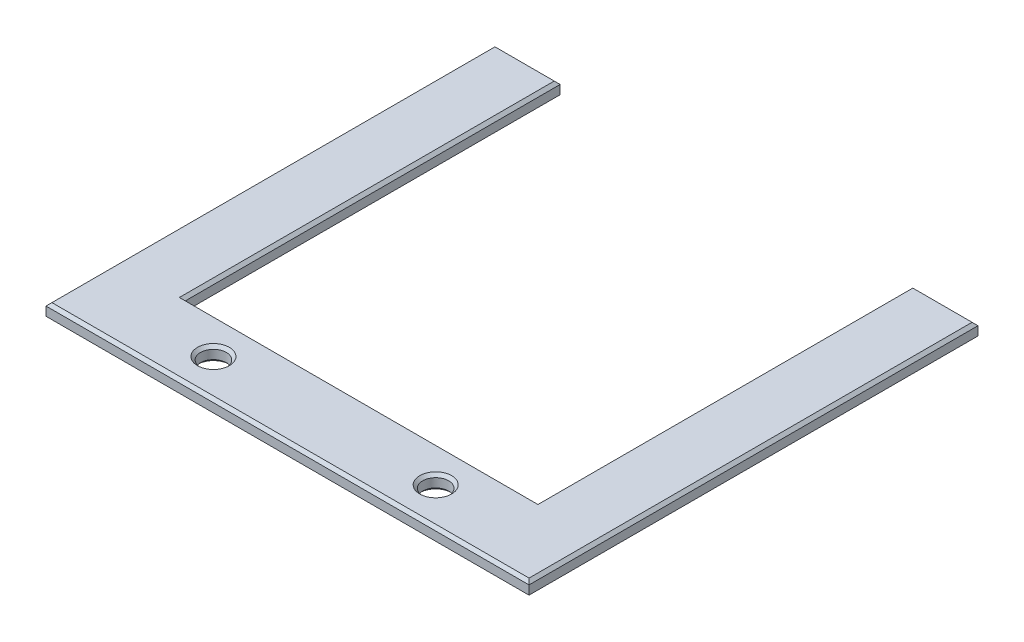
ISO-10303-21;
HEADER;
FILE_DESCRIPTION(('STEP AP214'),'2;1');
FILE_NAME('part.step','',(''),(''),'','','');
FILE_SCHEMA(('AUTOMOTIVE_DESIGN { 1 0 10303 214 1 1 1 1 }'));
ENDSEC;
DATA;
#1=APPLICATION_CONTEXT('core data for automotive mechanical design processes');
#2=APPLICATION_PROTOCOL_DEFINITION('international standard','automotive_design',2000,#1);
#3=PRODUCT_CONTEXT('',#1,'mechanical');
#4=PRODUCT('Part','Part','',(#3));
#5=PRODUCT_RELATED_PRODUCT_CATEGORY('part','',(#4));
#6=PRODUCT_DEFINITION_FORMATION('','',#4);
#7=PRODUCT_DEFINITION_CONTEXT('part definition',#1,'design');
#8=PRODUCT_DEFINITION('design','',#6,#7);
#9=PRODUCT_DEFINITION_SHAPE('','',#8);
#10=(LENGTH_UNIT() NAMED_UNIT(*) SI_UNIT(.MILLI.,.METRE.));
#11=(NAMED_UNIT(*) PLANE_ANGLE_UNIT() SI_UNIT($,.RADIAN.));
#12=(NAMED_UNIT(*) SI_UNIT($,.STERADIAN.) SOLID_ANGLE_UNIT());
#13=UNCERTAINTY_MEASURE_WITH_UNIT(LENGTH_MEASURE(1.E-05),#10,'distance_accuracy_value','');
#14=(GEOMETRIC_REPRESENTATION_CONTEXT(3) GLOBAL_UNCERTAINTY_ASSIGNED_CONTEXT((#13)) GLOBAL_UNIT_ASSIGNED_CONTEXT((#10,
#11,#12)) REPRESENTATION_CONTEXT('',''));
#15=CARTESIAN_POINT('',(0.,0.,0.));
#16=DIRECTION('',(0.,0.,1.));
#17=DIRECTION('',(1.,0.,0.));
#18=AXIS2_PLACEMENT_3D('',#15,#16,#17);
#19=CARTESIAN_POINT('',(0.,2.,0.));
#20=DIRECTION('',(0.,1.,0.));
#21=DIRECTION('',(0.,0.,1.));
#22=AXIS2_PLACEMENT_3D('',#19,#20,#21);
#23=PLANE('',#22);
#24=CARTESIAN_POINT('',(15.,2.,-5.));
#25=DIRECTION('',(0.,1.,0.));
#26=DIRECTION('',(0.,0.,1.));
#27=AXIS2_PLACEMENT_3D('',#24,#25,#26);
#28=CIRCLE('',#27,2.15000000000001);
#29=CARTESIAN_POINT('',(15.,2.,-2.84999999999999));
#30=VERTEX_POINT('',#29);
#31=EDGE_CURVE('E11',#30,#30,#28,.F.);
#32=ORIENTED_EDGE('',*,*,#31,.T.);
#33=EDGE_LOOP('',(#32));
#34=FACE_BOUND('',#33,.T.);
#35=DIRECTION('',(0.,0.,-1.));
#36=VECTOR('',#35,1.);
#37=CARTESIAN_POINT('',(-24.2,2.,-60.6));
#38=LINE('',#37,#36);
#39=CARTESIAN_POINT('',(-24.2,2.,-9.59999999999998));
#40=VERTEX_POINT('',#39);
#41=CARTESIAN_POINT('',(-24.2,2.,-60.2));
#42=VERTEX_POINT('',#41);
#43=EDGE_CURVE('E53',#40,#42,#38,.T.);
#44=ORIENTED_EDGE('',*,*,#43,.T.);
#45=DIRECTION('',(-1.,0.,0.));
#46=VECTOR('',#45,1.);
#47=CARTESIAN_POINT('',(-32.6,2.,-60.2));
#48=LINE('',#47,#46);
#49=CARTESIAN_POINT('',(-32.2,2.,-60.2));
#50=VERTEX_POINT('',#49);
#51=EDGE_CURVE('E45',#42,#50,#48,.T.);
#52=ORIENTED_EDGE('',*,*,#51,.T.);
#53=DIRECTION('',(0.,0.,1.));
#54=VECTOR('',#53,1.);
#55=CARTESIAN_POINT('',(-32.2,2.,0.));
#56=LINE('',#55,#54);
#57=CARTESIAN_POINT('',(-32.2,2.,-0.400000000000011));
#58=VERTEX_POINT('',#57);
#59=EDGE_CURVE('E236',#50,#58,#56,.T.);
#60=ORIENTED_EDGE('',*,*,#59,.T.);
#61=DIRECTION('',(1.,0.,0.));
#62=VECTOR('',#61,1.);
#63=CARTESIAN_POINT('',(32.6,2.,-0.400000000000011));
#64=LINE('',#63,#62);
#65=CARTESIAN_POINT('',(32.2,2.,-0.400000000000011));
#66=VERTEX_POINT('',#65);
#67=EDGE_CURVE('E238',#58,#66,#64,.T.);
#68=ORIENTED_EDGE('',*,*,#67,.T.);
#69=DIRECTION('',(0.,0.,-1.));
#70=VECTOR('',#69,1.);
#71=CARTESIAN_POINT('',(32.2,2.,-60.6));
#72=LINE('',#71,#70);
#73=CARTESIAN_POINT('',(32.2,2.,-60.2));
#74=VERTEX_POINT('',#73);
#75=EDGE_CURVE('E240',#66,#74,#72,.T.);
#76=ORIENTED_EDGE('',*,*,#75,.T.);
#77=DIRECTION('',(-1.,0.,0.));
#78=VECTOR('',#77,1.);
#79=CARTESIAN_POINT('',(23.8,2.,-60.2));
#80=LINE('',#79,#78);
#81=CARTESIAN_POINT('',(24.2,2.,-60.2));
#82=VERTEX_POINT('',#81);
#83=EDGE_CURVE('E242',#74,#82,#80,.T.);
#84=ORIENTED_EDGE('',*,*,#83,.T.);
#85=DIRECTION('',(0.,0.,1.));
#86=VECTOR('',#85,1.);
#87=CARTESIAN_POINT('',(24.2,2.,-9.99999999999999));
#88=LINE('',#87,#86);
#89=CARTESIAN_POINT('',(24.2,2.,-9.59999999999998));
#90=VERTEX_POINT('',#89);
#91=EDGE_CURVE('E244',#82,#90,#88,.T.);
#92=ORIENTED_EDGE('',*,*,#91,.T.);
#93=DIRECTION('',(-1.,0.,0.));
#94=VECTOR('',#93,1.);
#95=CARTESIAN_POINT('',(-23.8,2.,-9.59999999999998));
#96=LINE('',#95,#94);
#97=EDGE_CURVE('E58',#90,#40,#96,.T.);
#98=ORIENTED_EDGE('',*,*,#97,.T.);
#99=EDGE_LOOP('',(#44,#52,#60,#68,#76,#84,#92,#98));
#100=FACE_BOUND('',#99,.T.);
#101=CARTESIAN_POINT('',(-15.,2.,-5.));
#102=DIRECTION('',(0.,1.,0.));
#103=DIRECTION('',(0.,0.,1.));
#104=AXIS2_PLACEMENT_3D('',#101,#102,#103);
#105=CIRCLE('',#104,2.15);
#106=CARTESIAN_POINT('',(-15.,2.,-2.85));
#107=VERTEX_POINT('',#106);
#108=EDGE_CURVE('E233',#107,#107,#105,.F.);
#109=ORIENTED_EDGE('',*,*,#108,.T.);
#110=EDGE_LOOP('',(#109));
#111=FACE_BOUND('',#110,.T.);
#112=ADVANCED_FACE('F35',(#34,#100,#111),#23,.T.);
#113=CARTESIAN_POINT('',(0.,0.,0.));
#114=DIRECTION('',(0.,1.,0.));
#115=DIRECTION('',(0.,0.,1.));
#116=AXIS2_PLACEMENT_3D('',#113,#114,#115);
#117=PLANE('',#116);
#118=CARTESIAN_POINT('',(15.,0.,-5.));
#119=DIRECTION('',(0.,1.,0.));
#120=DIRECTION('',(0.,0.,1.));
#121=AXIS2_PLACEMENT_3D('',#118,#119,#120);
#122=CIRCLE('',#121,2.15000000000001);
#123=CARTESIAN_POINT('',(15.,0.,-2.84999999999999));
#124=VERTEX_POINT('',#123);
#125=EDGE_CURVE('E181',#124,#124,#122,.T.);
#126=ORIENTED_EDGE('',*,*,#125,.T.);
#127=EDGE_LOOP('',(#126));
#128=FACE_BOUND('',#127,.T.);
#129=CARTESIAN_POINT('',(-15.,0.,-5.));
#130=DIRECTION('',(0.,1.,0.));
#131=DIRECTION('',(0.,0.,1.));
#132=AXIS2_PLACEMENT_3D('',#129,#130,#131);
#133=CIRCLE('',#132,2.14999999999998);
#134=CARTESIAN_POINT('',(-15.,0.,-2.85000000000002));
#135=VERTEX_POINT('',#134);
#136=EDGE_CURVE('E178',#135,#135,#133,.T.);
#137=ORIENTED_EDGE('',*,*,#136,.T.);
#138=EDGE_LOOP('',(#137));
#139=FACE_BOUND('',#138,.T.);
#140=DIRECTION('',(0.,0.,1.));
#141=VECTOR('',#140,1.);
#142=CARTESIAN_POINT('',(32.2,0.,0.));
#143=LINE('',#142,#141);
#144=CARTESIAN_POINT('',(32.2,0.,-60.2));
#145=VERTEX_POINT('',#144);
#146=CARTESIAN_POINT('',(32.2,0.,-0.399999999999998));
#147=VERTEX_POINT('',#146);
#148=EDGE_CURVE('E177',#145,#147,#143,.T.);
#149=ORIENTED_EDGE('',*,*,#148,.T.);
#150=DIRECTION('',(-1.,0.,0.));
#151=VECTOR('',#150,1.);
#152=CARTESIAN_POINT('',(0.,0.,-0.399999999999998));
#153=LINE('',#152,#151);
#154=CARTESIAN_POINT('',(-32.2,0.,-0.399999999999998));
#155=VERTEX_POINT('',#154);
#156=EDGE_CURVE('E156',#147,#155,#153,.T.);
#157=ORIENTED_EDGE('',*,*,#156,.T.);
#158=DIRECTION('',(0.,0.,-1.));
#159=VECTOR('',#158,1.);
#160=CARTESIAN_POINT('',(-32.2,0.,0.));
#161=LINE('',#160,#159);
#162=CARTESIAN_POINT('',(-32.2,0.,-60.2));
#163=VERTEX_POINT('',#162);
#164=EDGE_CURVE('E166',#155,#163,#161,.T.);
#165=ORIENTED_EDGE('',*,*,#164,.T.);
#166=DIRECTION('',(1.,0.,0.));
#167=VECTOR('',#166,1.);
#168=CARTESIAN_POINT('',(0.,0.,-60.2));
#169=LINE('',#168,#167);
#170=CARTESIAN_POINT('',(-24.2,0.,-60.2));
#171=VERTEX_POINT('',#170);
#172=EDGE_CURVE('E172',#163,#171,#169,.T.);
#173=ORIENTED_EDGE('',*,*,#172,.T.);
#174=DIRECTION('',(0.,0.,1.));
#175=VECTOR('',#174,1.);
#176=CARTESIAN_POINT('',(-24.2,0.,0.));
#177=LINE('',#176,#175);
#178=CARTESIAN_POINT('',(-24.2,0.,-9.6));
#179=VERTEX_POINT('',#178);
#180=EDGE_CURVE('E322',#171,#179,#177,.T.);
#181=ORIENTED_EDGE('',*,*,#180,.T.);
#182=DIRECTION('',(1.,0.,0.));
#183=VECTOR('',#182,1.);
#184=CARTESIAN_POINT('',(0.,0.,-9.6));
#185=LINE('',#184,#183);
#186=CARTESIAN_POINT('',(24.2,0.,-9.6));
#187=VERTEX_POINT('',#186);
#188=EDGE_CURVE('E324',#179,#187,#185,.T.);
#189=ORIENTED_EDGE('',*,*,#188,.T.);
#190=DIRECTION('',(0.,0.,-1.));
#191=VECTOR('',#190,1.);
#192=CARTESIAN_POINT('',(24.2,0.,0.));
#193=LINE('',#192,#191);
#194=CARTESIAN_POINT('',(24.2,0.,-60.2));
#195=VERTEX_POINT('',#194);
#196=EDGE_CURVE('E326',#187,#195,#193,.T.);
#197=ORIENTED_EDGE('',*,*,#196,.T.);
#198=DIRECTION('',(1.,0.,0.));
#199=VECTOR('',#198,1.);
#200=CARTESIAN_POINT('',(0.,0.,-60.2));
#201=LINE('',#200,#199);
#202=EDGE_CURVE('E183',#195,#145,#201,.T.);
#203=ORIENTED_EDGE('',*,*,#202,.T.);
#204=EDGE_LOOP('',(#149,#157,#165,#173,#181,#189,#197,#203));
#205=FACE_BOUND('',#204,.T.);
#206=ADVANCED_FACE('F175',(#128,#139,#205),#117,.F.);
#207=CARTESIAN_POINT('',(-32.6,2.,-60.6));
#208=DIRECTION('',(1.,0.,0.));
#209=DIRECTION('',(0.,0.,-1.));
#210=AXIS2_PLACEMENT_3D('',#207,#208,#209);
#211=PLANE('',#210);
#212=DIRECTION('',(0.,-1.,0.));
#213=VECTOR('',#212,1.);
#214=CARTESIAN_POINT('',(-32.6,2.,-60.6));
#215=LINE('',#214,#213);
#216=CARTESIAN_POINT('',(-32.6,1.59999999999999,-60.6));
#217=VERTEX_POINT('',#216);
#218=CARTESIAN_POINT('',(-32.6,0.399999999999984,-60.6));
#219=VERTEX_POINT('',#218);
#220=EDGE_CURVE('E265',#217,#219,#215,.T.);
#221=ORIENTED_EDGE('',*,*,#220,.T.);
#222=DIRECTION('',(0.,0.,1.));
#223=VECTOR('',#222,1.);
#224=CARTESIAN_POINT('',(-32.6,0.399999999999984,-60.6));
#225=LINE('',#224,#223);
#226=CARTESIAN_POINT('',(-32.6,0.399999999999984,0.));
#227=VERTEX_POINT('',#226);
#228=EDGE_CURVE('E231',#219,#227,#225,.T.);
#229=ORIENTED_EDGE('',*,*,#228,.T.);
#230=DIRECTION('',(0.,-1.,0.));
#231=VECTOR('',#230,1.);
#232=CARTESIAN_POINT('',(-32.6,2.,0.));
#233=LINE('',#232,#231);
#234=CARTESIAN_POINT('',(-32.6,1.59999999999999,0.));
#235=VERTEX_POINT('',#234);
#236=EDGE_CURVE('E173',#235,#227,#233,.T.);
#237=ORIENTED_EDGE('',*,*,#236,.F.);
#238=DIRECTION('',(0.,0.,-1.));
#239=VECTOR('',#238,1.);
#240=CARTESIAN_POINT('',(-32.6,1.59999999999999,-60.6));
#241=LINE('',#240,#239);
#242=EDGE_CURVE('E229',#235,#217,#241,.T.);
#243=ORIENTED_EDGE('',*,*,#242,.T.);
#244=EDGE_LOOP('',(#221,#229,#237,#243));
#245=FACE_BOUND('',#244,.T.);
#246=ADVANCED_FACE('F343',(#245),#211,.F.);
#247=CARTESIAN_POINT('',(-32.6,2.,0.));
#248=DIRECTION('',(0.,0.,-1.));
#249=DIRECTION('',(-1.,0.,0.));
#250=AXIS2_PLACEMENT_3D('',#247,#248,#249);
#251=PLANE('',#250);
#252=ORIENTED_EDGE('',*,*,#236,.T.);
#253=DIRECTION('',(1.,0.,0.));
#254=VECTOR('',#253,1.);
#255=CARTESIAN_POINT('',(-32.6,0.399999999999984,0.));
#256=LINE('',#255,#254);
#257=CARTESIAN_POINT('',(32.6,0.399999999999984,0.));
#258=VERTEX_POINT('',#257);
#259=EDGE_CURVE('E159',#227,#258,#256,.T.);
#260=ORIENTED_EDGE('',*,*,#259,.T.);
#261=DIRECTION('',(0.,-1.,0.));
#262=VECTOR('',#261,1.);
#263=CARTESIAN_POINT('',(32.6,2.,0.));
#264=LINE('',#263,#262);
#265=CARTESIAN_POINT('',(32.6,1.59999999999999,0.));
#266=VERTEX_POINT('',#265);
#267=EDGE_CURVE('E312',#266,#258,#264,.T.);
#268=ORIENTED_EDGE('',*,*,#267,.F.);
#269=DIRECTION('',(-1.,0.,0.));
#270=VECTOR('',#269,1.);
#271=CARTESIAN_POINT('',(-32.6,1.59999999999999,0.));
#272=LINE('',#271,#270);
#273=EDGE_CURVE('E201',#266,#235,#272,.T.);
#274=ORIENTED_EDGE('',*,*,#273,.T.);
#275=EDGE_LOOP('',(#252,#260,#268,#274));
#276=FACE_BOUND('',#275,.T.);
#277=ADVANCED_FACE('F336',(#276),#251,.F.);
#278=CARTESIAN_POINT('',(32.6,2.,0.));
#279=DIRECTION('',(-1.,0.,0.));
#280=DIRECTION('',(0.,0.,1.));
#281=AXIS2_PLACEMENT_3D('',#278,#279,#280);
#282=PLANE('',#281);
#283=ORIENTED_EDGE('',*,*,#267,.T.);
#284=DIRECTION('',(0.,0.,-1.));
#285=VECTOR('',#284,1.);
#286=CARTESIAN_POINT('',(32.6,0.399999999999984,0.));
#287=LINE('',#286,#285);
#288=CARTESIAN_POINT('',(32.6,0.399999999999984,-60.6));
#289=VERTEX_POINT('',#288);
#290=EDGE_CURVE('E206',#258,#289,#287,.T.);
#291=ORIENTED_EDGE('',*,*,#290,.T.);
#292=DIRECTION('',(0.,-1.,0.));
#293=VECTOR('',#292,1.);
#294=CARTESIAN_POINT('',(32.6,2.,-60.6));
#295=LINE('',#294,#293);
#296=CARTESIAN_POINT('',(32.6,1.59999999999999,-60.6));
#297=VERTEX_POINT('',#296);
#298=EDGE_CURVE('E303',#297,#289,#295,.T.);
#299=ORIENTED_EDGE('',*,*,#298,.F.);
#300=DIRECTION('',(0.,0.,1.));
#301=VECTOR('',#300,1.);
#302=CARTESIAN_POINT('',(32.6,1.59999999999999,0.));
#303=LINE('',#302,#301);
#304=EDGE_CURVE('E204',#297,#266,#303,.T.);
#305=ORIENTED_EDGE('',*,*,#304,.T.);
#306=EDGE_LOOP('',(#283,#291,#299,#305));
#307=FACE_BOUND('',#306,.T.);
#308=ADVANCED_FACE('F309',(#307),#282,.F.);
#309=CARTESIAN_POINT('',(32.6,2.,-60.6));
#310=DIRECTION('',(0.,0.,1.));
#311=DIRECTION('',(1.,0.,0.));
#312=AXIS2_PLACEMENT_3D('',#309,#310,#311);
#313=PLANE('',#312);
#314=ORIENTED_EDGE('',*,*,#298,.T.);
#315=DIRECTION('',(-1.,0.,0.));
#316=VECTOR('',#315,1.);
#317=CARTESIAN_POINT('',(32.6,0.399999999999984,-60.6));
#318=LINE('',#317,#316);
#319=CARTESIAN_POINT('',(23.8,0.399999999999984,-60.6));
#320=VERTEX_POINT('',#319);
#321=EDGE_CURVE('E210',#289,#320,#318,.T.);
#322=ORIENTED_EDGE('',*,*,#321,.T.);
#323=DIRECTION('',(0.,-1.,0.));
#324=VECTOR('',#323,1.);
#325=CARTESIAN_POINT('',(23.8,2.,-60.6));
#326=LINE('',#325,#324);
#327=CARTESIAN_POINT('',(23.8,1.59999999999999,-60.6));
#328=VERTEX_POINT('',#327);
#329=EDGE_CURVE('E306',#328,#320,#326,.T.);
#330=ORIENTED_EDGE('',*,*,#329,.F.);
#331=DIRECTION('',(1.,0.,0.));
#332=VECTOR('',#331,1.);
#333=CARTESIAN_POINT('',(32.6,1.59999999999999,-60.6));
#334=LINE('',#333,#332);
#335=EDGE_CURVE('E208',#328,#297,#334,.T.);
#336=ORIENTED_EDGE('',*,*,#335,.T.);
#337=EDGE_LOOP('',(#314,#322,#330,#336));
#338=FACE_BOUND('',#337,.T.);
#339=ADVANCED_FACE('F302',(#338),#313,.F.);
#340=CARTESIAN_POINT('',(23.8,2.,-60.6));
#341=DIRECTION('',(1.,0.,0.));
#342=DIRECTION('',(0.,0.,-1.));
#343=AXIS2_PLACEMENT_3D('',#340,#341,#342);
#344=PLANE('',#343);
#345=ORIENTED_EDGE('',*,*,#329,.T.);
#346=DIRECTION('',(0.,0.,1.));
#347=VECTOR('',#346,1.);
#348=CARTESIAN_POINT('',(23.8,0.399999999999984,-60.6));
#349=LINE('',#348,#347);
#350=CARTESIAN_POINT('',(23.8,0.399999999999984,-9.99999999999999));
#351=VERTEX_POINT('',#350);
#352=EDGE_CURVE('E214',#320,#351,#349,.T.);
#353=ORIENTED_EDGE('',*,*,#352,.T.);
#354=DIRECTION('',(0.,-1.,0.));
#355=VECTOR('',#354,1.);
#356=CARTESIAN_POINT('',(23.8,2.,-9.99999999999999));
#357=LINE('',#356,#355);
#358=CARTESIAN_POINT('',(23.8,1.59999999999999,-9.99999999999999));
#359=VERTEX_POINT('',#358);
#360=EDGE_CURVE('E315',#359,#351,#357,.T.);
#361=ORIENTED_EDGE('',*,*,#360,.F.);
#362=DIRECTION('',(0.,0.,-1.));
#363=VECTOR('',#362,1.);
#364=CARTESIAN_POINT('',(23.8,1.59999999999999,-60.6));
#365=LINE('',#364,#363);
#366=EDGE_CURVE('E212',#359,#328,#365,.T.);
#367=ORIENTED_EDGE('',*,*,#366,.T.);
#368=EDGE_LOOP('',(#345,#353,#361,#367));
#369=FACE_BOUND('',#368,.T.);
#370=ADVANCED_FACE('F388',(#369),#344,.F.);
#371=CARTESIAN_POINT('',(23.8,2.,-9.99999999999999));
#372=DIRECTION('',(0.,0.,1.));
#373=DIRECTION('',(1.,0.,0.));
#374=AXIS2_PLACEMENT_3D('',#371,#372,#373);
#375=PLANE('',#374);
#376=ORIENTED_EDGE('',*,*,#360,.T.);
#377=DIRECTION('',(-1.,0.,0.));
#378=VECTOR('',#377,1.);
#379=CARTESIAN_POINT('',(23.8,0.399999999999984,-9.99999999999999));
#380=LINE('',#379,#378);
#381=CARTESIAN_POINT('',(-23.8,0.399999999999984,-9.99999999999999));
#382=VERTEX_POINT('',#381);
#383=EDGE_CURVE('E218',#351,#382,#380,.T.);
#384=ORIENTED_EDGE('',*,*,#383,.T.);
#385=DIRECTION('',(0.,-1.,0.));
#386=VECTOR('',#385,1.);
#387=CARTESIAN_POINT('',(-23.8,2.,-9.99999999999999));
#388=LINE('',#387,#386);
#389=CARTESIAN_POINT('',(-23.8,1.59999999999999,-9.99999999999999));
#390=VERTEX_POINT('',#389);
#391=EDGE_CURVE('E369',#390,#382,#388,.T.);
#392=ORIENTED_EDGE('',*,*,#391,.F.);
#393=DIRECTION('',(1.,0.,0.));
#394=VECTOR('',#393,1.);
#395=CARTESIAN_POINT('',(23.8,1.59999999999999,-9.99999999999999));
#396=LINE('',#395,#394);
#397=EDGE_CURVE('E216',#390,#359,#396,.T.);
#398=ORIENTED_EDGE('',*,*,#397,.T.);
#399=EDGE_LOOP('',(#376,#384,#392,#398));
#400=FACE_BOUND('',#399,.T.);
#401=ADVANCED_FACE('F377',(#400),#375,.F.);
#402=CARTESIAN_POINT('',(-23.8,2.,-9.99999999999999));
#403=DIRECTION('',(-1.,0.,0.));
#404=DIRECTION('',(0.,0.,1.));
#405=AXIS2_PLACEMENT_3D('',#402,#403,#404);
#406=PLANE('',#405);
#407=ORIENTED_EDGE('',*,*,#391,.T.);
#408=DIRECTION('',(0.,0.,-1.));
#409=VECTOR('',#408,1.);
#410=CARTESIAN_POINT('',(-23.8,0.399999999999984,-9.99999999999999));
#411=LINE('',#410,#409);
#412=CARTESIAN_POINT('',(-23.8,0.399999999999984,-60.6));
#413=VERTEX_POINT('',#412);
#414=EDGE_CURVE('E222',#382,#413,#411,.T.);
#415=ORIENTED_EDGE('',*,*,#414,.T.);
#416=DIRECTION('',(0.,-1.,0.));
#417=VECTOR('',#416,1.);
#418=CARTESIAN_POINT('',(-23.8,2.,-60.6));
#419=LINE('',#418,#417);
#420=CARTESIAN_POINT('',(-23.8,1.59999999999999,-60.6));
#421=VERTEX_POINT('',#420);
#422=EDGE_CURVE('E362',#421,#413,#419,.T.);
#423=ORIENTED_EDGE('',*,*,#422,.F.);
#424=DIRECTION('',(0.,0.,1.));
#425=VECTOR('',#424,1.);
#426=CARTESIAN_POINT('',(-23.8,1.59999999999999,-9.99999999999999));
#427=LINE('',#426,#425);
#428=EDGE_CURVE('E220',#421,#390,#427,.T.);
#429=ORIENTED_EDGE('',*,*,#428,.T.);
#430=EDGE_LOOP('',(#407,#415,#423,#429));
#431=FACE_BOUND('',#430,.T.);
#432=ADVANCED_FACE('F366',(#431),#406,.F.);
#433=CARTESIAN_POINT('',(-23.8,2.,-60.6));
#434=DIRECTION('',(0.,0.,1.));
#435=DIRECTION('',(1.,0.,0.));
#436=AXIS2_PLACEMENT_3D('',#433,#434,#435);
#437=PLANE('',#436);
#438=ORIENTED_EDGE('',*,*,#422,.T.);
#439=DIRECTION('',(-1.,0.,0.));
#440=VECTOR('',#439,1.);
#441=CARTESIAN_POINT('',(-23.8,0.399999999999984,-60.6));
#442=LINE('',#441,#440);
#443=EDGE_CURVE('E227',#413,#219,#442,.T.);
#444=ORIENTED_EDGE('',*,*,#443,.T.);
#445=ORIENTED_EDGE('',*,*,#220,.F.);
#446=DIRECTION('',(1.,0.,0.));
#447=VECTOR('',#446,1.);
#448=CARTESIAN_POINT('',(-23.8,1.59999999999999,-60.6));
#449=LINE('',#448,#447);
#450=EDGE_CURVE('E224',#217,#421,#449,.T.);
#451=ORIENTED_EDGE('',*,*,#450,.T.);
#452=EDGE_LOOP('',(#438,#444,#445,#451));
#453=FACE_BOUND('',#452,.T.);
#454=ADVANCED_FACE('F361',(#453),#437,.F.);
#455=CARTESIAN_POINT('',(-15.,2.,-5.));
#456=DIRECTION('',(0.,-1.,0.));
#457=DIRECTION('',(0.,0.,-1.));
#458=AXIS2_PLACEMENT_3D('',#455,#456,#457);
#459=CYLINDRICAL_SURFACE('',#458,1.75);
#460=CARTESIAN_POINT('',(-15.,0.399999999999983,-5.));
#461=DIRECTION('',(0.,1.,0.));
#462=DIRECTION('',(0.,0.,1.));
#463=AXIS2_PLACEMENT_3D('',#460,#461,#462);
#464=CIRCLE('',#463,1.75);
#465=CARTESIAN_POINT('',(-15.,0.399999999999983,-3.25));
#466=VERTEX_POINT('',#465);
#467=EDGE_CURVE('E198',#466,#466,#464,.F.);
#468=ORIENTED_EDGE('',*,*,#467,.T.);
#469=EDGE_LOOP('',(#468));
#470=FACE_BOUND('',#469,.T.);
#471=CARTESIAN_POINT('',(-15.,1.59999999999999,-5.));
#472=DIRECTION('',(0.,1.,0.));
#473=DIRECTION('',(0.,0.,1.));
#474=AXIS2_PLACEMENT_3D('',#471,#472,#473);
#475=CIRCLE('',#474,1.75);
#476=CARTESIAN_POINT('',(-15.,1.59999999999999,-3.25));
#477=VERTEX_POINT('',#476);
#478=EDGE_CURVE('E195',#477,#477,#475,.T.);
#479=ORIENTED_EDGE('',*,*,#478,.T.);
#480=EDGE_LOOP('',(#479));
#481=FACE_BOUND('',#480,.T.);
#482=ADVANCED_FACE('F406',(#470,#481),#459,.F.);
#483=CARTESIAN_POINT('',(15.,2.,-5.));
#484=DIRECTION('',(0.,-1.,0.));
#485=DIRECTION('',(0.,0.,-1.));
#486=AXIS2_PLACEMENT_3D('',#483,#484,#485);
#487=CYLINDRICAL_SURFACE('',#486,1.75);
#488=CARTESIAN_POINT('',(15.,0.400000000000004,-5.));
#489=DIRECTION('',(0.,1.,0.));
#490=DIRECTION('',(0.,0.,1.));
#491=AXIS2_PLACEMENT_3D('',#488,#489,#490);
#492=CIRCLE('',#491,1.75);
#493=CARTESIAN_POINT('',(15.,0.400000000000004,-3.25));
#494=VERTEX_POINT('',#493);
#495=EDGE_CURVE('E192',#494,#494,#492,.F.);
#496=ORIENTED_EDGE('',*,*,#495,.T.);
#497=EDGE_LOOP('',(#496));
#498=FACE_BOUND('',#497,.T.);
#499=CARTESIAN_POINT('',(15.,1.6,-5.));
#500=DIRECTION('',(0.,1.,0.));
#501=DIRECTION('',(0.,0.,1.));
#502=AXIS2_PLACEMENT_3D('',#499,#500,#501);
#503=CIRCLE('',#502,1.75);
#504=CARTESIAN_POINT('',(15.,1.6,-3.25));
#505=VERTEX_POINT('',#504);
#506=EDGE_CURVE('E189',#505,#505,#503,.T.);
#507=ORIENTED_EDGE('',*,*,#506,.T.);
#508=EDGE_LOOP('',(#507));
#509=FACE_BOUND('',#508,.T.);
#510=ADVANCED_FACE('F426',(#498,#509),#487,.F.);
#511=CARTESIAN_POINT('',(15.,0.,-5.));
#512=DIRECTION('',(0.,-1.,0.));
#513=DIRECTION('',(0.,0.,-1.));
#514=AXIS2_PLACEMENT_3D('',#511,#512,#513);
#515=CONICAL_SURFACE('',#514,2.15000000000001,0.785398163397451);
#516=ORIENTED_EDGE('',*,*,#495,.F.);
#517=EDGE_LOOP('',(#516));
#518=FACE_BOUND('',#517,.T.);
#519=ORIENTED_EDGE('',*,*,#125,.F.);
#520=EDGE_LOOP('',(#519));
#521=FACE_BOUND('',#520,.T.);
#522=ADVANCED_FACE('F433',(#518,#521),#515,.F.);
#523=CARTESIAN_POINT('',(-15.,0.,-5.));
#524=DIRECTION('',(0.,-1.,0.));
#525=DIRECTION('',(0.,0.,-1.));
#526=AXIS2_PLACEMENT_3D('',#523,#524,#525);
#527=CONICAL_SURFACE('',#526,2.14999999999998,0.785398163397443);
#528=ORIENTED_EDGE('',*,*,#467,.F.);
#529=EDGE_LOOP('',(#528));
#530=FACE_BOUND('',#529,.T.);
#531=ORIENTED_EDGE('',*,*,#136,.F.);
#532=EDGE_LOOP('',(#531));
#533=FACE_BOUND('',#532,.T.);
#534=ADVANCED_FACE('F440',(#530,#533),#527,.F.);
#535=CARTESIAN_POINT('',(23.8,0.399999999999984,-9.99999999999999));
#536=DIRECTION('',(0.,0.70710678118656,0.707106781186535));
#537=DIRECTION('',(-1.,0.,0.));
#538=AXIS2_PLACEMENT_3D('',#535,#536,#537);
#539=PLANE('',#538);
#540=DIRECTION('',(0.577350269189633,-0.577350269189612,0.577350269189633));
#541=VECTOR('',#540,1.);
#542=CARTESIAN_POINT('',(6.93333333333294,17.2666666666665,-26.8666666666671));
#543=LINE('',#542,#541);
#544=EDGE_CURVE('E259',#187,#351,#543,.F.);
#545=ORIENTED_EDGE('',*,*,#544,.F.);
#546=ORIENTED_EDGE('',*,*,#188,.F.);
#547=DIRECTION('',(-0.577350269189633,-0.577350269189612,0.577350269189633));
#548=VECTOR('',#547,1.);
#549=CARTESIAN_POINT('',(-7.93333333333297,16.2666666666665,-25.866666666667));
#550=LINE('',#549,#548);
#551=EDGE_CURVE('E262',#382,#179,#550,.T.);
#552=ORIENTED_EDGE('',*,*,#551,.F.);
#553=ORIENTED_EDGE('',*,*,#383,.F.);
#554=EDGE_LOOP('',(#545,#546,#552,#553));
#555=FACE_BOUND('',#554,.T.);
#556=ADVANCED_FACE('F383',(#555),#539,.F.);
#557=CARTESIAN_POINT('',(-23.8,0.399999999999984,-9.99999999999999));
#558=DIRECTION('',(-0.707106781186535,0.70710678118656,0.));
#559=DIRECTION('',(0.,0.,-1.));
#560=AXIS2_PLACEMENT_3D('',#557,#558,#559);
#561=PLANE('',#560);
#562=ORIENTED_EDGE('',*,*,#551,.T.);
#563=ORIENTED_EDGE('',*,*,#180,.F.);
#564=DIRECTION('',(-0.57735026918963,-0.57735026918961,0.577350269189637));
#565=VECTOR('',#564,1.);
#566=CARTESIAN_POINT('',(-23.8,0.399999999999984,-60.6));
#567=LINE('',#566,#565);
#568=EDGE_CURVE('E256',#413,#171,#567,.T.);
#569=ORIENTED_EDGE('',*,*,#568,.F.);
#570=ORIENTED_EDGE('',*,*,#414,.F.);
#571=EDGE_LOOP('',(#562,#563,#569,#570));
#572=FACE_BOUND('',#571,.T.);
#573=ADVANCED_FACE('F455',(#572),#561,.F.);
#574=CARTESIAN_POINT('',(23.8,0.399999999999984,-60.6));
#575=DIRECTION('',(0.707106781186535,0.70710678118656,0.));
#576=DIRECTION('',(0.,0.,1.));
#577=AXIS2_PLACEMENT_3D('',#574,#575,#576);
#578=PLANE('',#577);
#579=ORIENTED_EDGE('',*,*,#544,.T.);
#580=ORIENTED_EDGE('',*,*,#352,.F.);
#581=DIRECTION('',(0.577350269189633,-0.577350269189613,0.577350269189631));
#582=VECTOR('',#581,1.);
#583=CARTESIAN_POINT('',(23.8,0.399999999999984,-60.6));
#584=LINE('',#583,#582);
#585=EDGE_CURVE('E253',#195,#320,#584,.F.);
#586=ORIENTED_EDGE('',*,*,#585,.F.);
#587=ORIENTED_EDGE('',*,*,#196,.F.);
#588=EDGE_LOOP('',(#579,#580,#586,#587));
#589=FACE_BOUND('',#588,.T.);
#590=ADVANCED_FACE('F387',(#589),#578,.F.);
#591=CARTESIAN_POINT('',(-23.8,0.399999999999984,-60.6));
#592=DIRECTION('',(0.,0.707106781186564,0.707106781186531));
#593=DIRECTION('',(-1.,0.,0.));
#594=AXIS2_PLACEMENT_3D('',#591,#592,#593);
#595=PLANE('',#594);
#596=ORIENTED_EDGE('',*,*,#568,.T.);
#597=ORIENTED_EDGE('',*,*,#172,.F.);
#598=DIRECTION('',(0.577350269189631,-0.57735026918961,0.577350269189637));
#599=VECTOR('',#598,1.);
#600=CARTESIAN_POINT('',(-32.6,0.399999999999984,-60.6));
#601=LINE('',#600,#599);
#602=EDGE_CURVE('E169',#219,#163,#601,.T.);
#603=ORIENTED_EDGE('',*,*,#602,.F.);
#604=ORIENTED_EDGE('',*,*,#443,.F.);
#605=EDGE_LOOP('',(#596,#597,#603,#604));
#606=FACE_BOUND('',#605,.T.);
#607=ADVANCED_FACE('F469',(#606),#595,.F.);
#608=CARTESIAN_POINT('',(32.6,0.399999999999984,-60.6));
#609=DIRECTION('',(0.,0.707106781186558,0.707106781186537));
#610=DIRECTION('',(-1.,0.,0.));
#611=AXIS2_PLACEMENT_3D('',#608,#609,#610);
#612=PLANE('',#611);
#613=ORIENTED_EDGE('',*,*,#585,.T.);
#614=ORIENTED_EDGE('',*,*,#321,.F.);
#615=DIRECTION('',(-0.577350269189634,-0.577350269189613,0.57735026918963));
#616=VECTOR('',#615,1.);
#617=CARTESIAN_POINT('',(32.6,0.399999999999984,-60.6));
#618=LINE('',#617,#616);
#619=EDGE_CURVE('E162',#145,#289,#618,.F.);
#620=ORIENTED_EDGE('',*,*,#619,.F.);
#621=ORIENTED_EDGE('',*,*,#202,.F.);
#622=EDGE_LOOP('',(#613,#614,#620,#621));
#623=FACE_BOUND('',#622,.T.);
#624=ADVANCED_FACE('F332',(#623),#612,.F.);
#625=CARTESIAN_POINT('',(-32.6,0.399999999999984,-60.6));
#626=DIRECTION('',(0.707106781186535,0.70710678118656,0.));
#627=DIRECTION('',(0.,0.,1.));
#628=AXIS2_PLACEMENT_3D('',#625,#626,#627);
#629=PLANE('',#628);
#630=ORIENTED_EDGE('',*,*,#602,.T.);
#631=ORIENTED_EDGE('',*,*,#164,.F.);
#632=DIRECTION('',(-0.577350269189632,0.577350269189613,0.577350269189633));
#633=VECTOR('',#632,1.);
#634=CARTESIAN_POINT('',(-12.3999999999995,-19.7999999999998,-20.2000000000005));
#635=LINE('',#634,#633);
#636=EDGE_CURVE('E152',#227,#155,#635,.F.);
#637=ORIENTED_EDGE('',*,*,#636,.F.);
#638=ORIENTED_EDGE('',*,*,#228,.F.);
#639=EDGE_LOOP('',(#630,#631,#637,#638));
#640=FACE_BOUND('',#639,.T.);
#641=ADVANCED_FACE('F167',(#640),#629,.F.);
#642=CARTESIAN_POINT('',(32.6,0.399999999999984,0.));
#643=DIRECTION('',(-0.707106781186535,0.70710678118656,0.));
#644=DIRECTION('',(0.,0.,-1.));
#645=AXIS2_PLACEMENT_3D('',#642,#643,#644);
#646=PLANE('',#645);
#647=ORIENTED_EDGE('',*,*,#619,.T.);
#648=ORIENTED_EDGE('',*,*,#290,.F.);
#649=DIRECTION('',(-0.577350269189632,-0.577350269189613,-0.577350269189633));
#650=VECTOR('',#649,1.);
#651=CARTESIAN_POINT('',(32.6,0.399999999999984,0.));
#652=LINE('',#651,#650);
#653=EDGE_CURVE('E163',#147,#258,#652,.F.);
#654=ORIENTED_EDGE('',*,*,#653,.F.);
#655=ORIENTED_EDGE('',*,*,#148,.F.);
#656=EDGE_LOOP('',(#647,#648,#654,#655));
#657=FACE_BOUND('',#656,.T.);
#658=ADVANCED_FACE('F334',(#657),#646,.F.);
#659=CARTESIAN_POINT('',(-32.6,0.399999999999984,0.));
#660=DIRECTION('',(0.,0.70710678118656,-0.707106781186535));
#661=DIRECTION('',(1.,0.,0.));
#662=AXIS2_PLACEMENT_3D('',#659,#660,#661);
#663=PLANE('',#662);
#664=ORIENTED_EDGE('',*,*,#636,.T.);
#665=ORIENTED_EDGE('',*,*,#156,.F.);
#666=ORIENTED_EDGE('',*,*,#653,.T.);
#667=ORIENTED_EDGE('',*,*,#259,.F.);
#668=EDGE_LOOP('',(#664,#665,#666,#667));
#669=FACE_BOUND('',#668,.T.);
#670=ADVANCED_FACE('F154',(#669),#663,.F.);
#671=CARTESIAN_POINT('',(15.,1.6,-5.));
#672=DIRECTION('',(0.,1.,0.));
#673=DIRECTION('',(0.,0.,1.));
#674=AXIS2_PLACEMENT_3D('',#671,#672,#673);
#675=CONICAL_SURFACE('',#674,1.75,0.785398163397459);
#676=ORIENTED_EDGE('',*,*,#31,.F.);
#677=EDGE_LOOP('',(#676));
#678=FACE_BOUND('',#677,.T.);
#679=ORIENTED_EDGE('',*,*,#506,.F.);
#680=EDGE_LOOP('',(#679));
#681=FACE_BOUND('',#680,.T.);
#682=ADVANCED_FACE('F501',(#678,#681),#675,.F.);
#683=CARTESIAN_POINT('',(0.,2.,-60.2));
#684=DIRECTION('',(0.,0.707106781186546,-0.707106781186549));
#685=DIRECTION('',(1.,0.,0.));
#686=AXIS2_PLACEMENT_3D('',#683,#684,#685);
#687=PLANE('',#686);
#688=DIRECTION('',(-0.577350269189627,0.577350269189627,0.577350269189623));
#689=VECTOR('',#688,1.);
#690=CARTESIAN_POINT('',(12.1333333333334,22.0666666666666,-40.1333333333335));
#691=LINE('',#690,#689);
#692=EDGE_CURVE('E281',#297,#74,#691,.T.);
#693=ORIENTED_EDGE('',*,*,#692,.F.);
#694=ORIENTED_EDGE('',*,*,#335,.F.);
#695=DIRECTION('',(0.577350269189627,0.577350269189627,0.577350269189624));
#696=VECTOR('',#695,1.);
#697=CARTESIAN_POINT('',(16.1333333333333,-6.06666666666669,-68.2666666666666));
#698=LINE('',#697,#696);
#699=EDGE_CURVE('E40',#82,#328,#698,.F.);
#700=ORIENTED_EDGE('',*,*,#699,.F.);
#701=ORIENTED_EDGE('',*,*,#83,.F.);
#702=EDGE_LOOP('',(#693,#694,#700,#701));
#703=FACE_BOUND('',#702,.T.);
#704=ADVANCED_FACE('F297',(#703),#687,.T.);
#705=CARTESIAN_POINT('',(24.2,2.,0.));
#706=DIRECTION('',(-0.707106781186548,0.707106781186548,0.));
#707=DIRECTION('',(0.,0.,-1.));
#708=AXIS2_PLACEMENT_3D('',#705,#706,#707);
#709=PLANE('',#708);
#710=ORIENTED_EDGE('',*,*,#699,.T.);
#711=ORIENTED_EDGE('',*,*,#366,.F.);
#712=DIRECTION('',(0.577350269189626,0.577350269189626,0.577350269189626));
#713=VECTOR('',#712,1.);
#714=CARTESIAN_POINT('',(16.1333333333333,-6.06666666666667,-17.6666666666667));
#715=LINE('',#714,#713);
#716=EDGE_CURVE('E279',#90,#359,#715,.F.);
#717=ORIENTED_EDGE('',*,*,#716,.F.);
#718=ORIENTED_EDGE('',*,*,#91,.F.);
#719=EDGE_LOOP('',(#710,#711,#717,#718));
#720=FACE_BOUND('',#719,.T.);
#721=ADVANCED_FACE('F292',(#720),#709,.T.);
#722=CARTESIAN_POINT('',(32.2,2.,0.));
#723=DIRECTION('',(0.707106781186548,0.707106781186548,0.));
#724=DIRECTION('',(0.,0.,1.));
#725=AXIS2_PLACEMENT_3D('',#722,#723,#724);
#726=PLANE('',#725);
#727=ORIENTED_EDGE('',*,*,#692,.T.);
#728=ORIENTED_EDGE('',*,*,#75,.F.);
#729=DIRECTION('',(-0.577350269189625,0.577350269189626,-0.577350269189626));
#730=VECTOR('',#729,1.);
#731=CARTESIAN_POINT('',(21.4666666666666,12.7333333333333,-11.1333333333333));
#732=LINE('',#731,#730);
#733=EDGE_CURVE('E276',#266,#66,#732,.T.);
#734=ORIENTED_EDGE('',*,*,#733,.F.);
#735=ORIENTED_EDGE('',*,*,#304,.F.);
#736=EDGE_LOOP('',(#727,#728,#734,#735));
#737=FACE_BOUND('',#736,.T.);
#738=ADVANCED_FACE('F520',(#737),#726,.T.);
#739=CARTESIAN_POINT('',(0.,2.,-9.59999999999998));
#740=DIRECTION('',(0.,0.707106781186548,-0.707106781186548));
#741=DIRECTION('',(1.,0.,0.));
#742=AXIS2_PLACEMENT_3D('',#739,#740,#741);
#743=PLANE('',#742);
#744=ORIENTED_EDGE('',*,*,#716,.T.);
#745=ORIENTED_EDGE('',*,*,#397,.F.);
#746=DIRECTION('',(-0.577350269189626,0.577350269189626,0.577350269189626));
#747=VECTOR('',#746,1.);
#748=CARTESIAN_POINT('',(-27.4,5.19999999999999,-6.39999999999999));
#749=LINE('',#748,#747);
#750=EDGE_CURVE('E273',#40,#390,#749,.F.);
#751=ORIENTED_EDGE('',*,*,#750,.F.);
#752=ORIENTED_EDGE('',*,*,#97,.F.);
#753=EDGE_LOOP('',(#744,#745,#751,#752));
#754=FACE_BOUND('',#753,.T.);
#755=ADVANCED_FACE('F527',(#754),#743,.T.);
#756=CARTESIAN_POINT('',(0.,2.,-0.400000000000011));
#757=DIRECTION('',(0.,0.707106781186548,0.707106781186548));
#758=DIRECTION('',(-1.,0.,0.));
#759=AXIS2_PLACEMENT_3D('',#756,#757,#758);
#760=PLANE('',#759);
#761=ORIENTED_EDGE('',*,*,#733,.T.);
#762=ORIENTED_EDGE('',*,*,#67,.F.);
#763=DIRECTION('',(0.577350269189625,0.577350269189626,-0.577350269189626));
#764=VECTOR('',#763,1.);
#765=CARTESIAN_POINT('',(-32.3333333333333,1.86666666666665,-0.266666666666664));
#766=LINE('',#765,#764);
#767=EDGE_CURVE('E270',#235,#58,#766,.T.);
#768=ORIENTED_EDGE('',*,*,#767,.F.);
#769=ORIENTED_EDGE('',*,*,#273,.F.);
#770=EDGE_LOOP('',(#761,#762,#768,#769));
#771=FACE_BOUND('',#770,.T.);
#772=ADVANCED_FACE('F348',(#771),#760,.T.);
#773=CARTESIAN_POINT('',(-24.2,2.,0.));
#774=DIRECTION('',(0.707106781186548,0.707106781186548,0.));
#775=DIRECTION('',(0.,0.,1.));
#776=AXIS2_PLACEMENT_3D('',#773,#774,#775);
#777=PLANE('',#776);
#778=ORIENTED_EDGE('',*,*,#750,.T.);
#779=ORIENTED_EDGE('',*,*,#428,.F.);
#780=DIRECTION('',(-0.577350269189623,0.577350269189623,0.577350269189631));
#781=VECTOR('',#780,1.);
#782=CARTESIAN_POINT('',(-44.2666666666668,22.0666666666667,-40.133333333333));
#783=LINE('',#782,#781);
#784=EDGE_CURVE('E268',#42,#421,#783,.F.);
#785=ORIENTED_EDGE('',*,*,#784,.F.);
#786=ORIENTED_EDGE('',*,*,#43,.F.);
#787=EDGE_LOOP('',(#778,#779,#785,#786));
#788=FACE_BOUND('',#787,.T.);
#789=ADVANCED_FACE('F541',(#788),#777,.T.);
#790=CARTESIAN_POINT('',(-32.2,2.,0.));
#791=DIRECTION('',(-0.707106781186548,0.707106781186548,0.));
#792=DIRECTION('',(0.,0.,-1.));
#793=AXIS2_PLACEMENT_3D('',#790,#791,#792);
#794=PLANE('',#793);
#795=ORIENTED_EDGE('',*,*,#767,.T.);
#796=ORIENTED_EDGE('',*,*,#59,.F.);
#797=DIRECTION('',(-0.577350269189624,-0.577350269189623,-0.57735026918963));
#798=VECTOR('',#797,1.);
#799=CARTESIAN_POINT('',(-12.1333333333332,22.0666666666668,-40.133333333333));
#800=LINE('',#799,#798);
#801=EDGE_CURVE('E266',#217,#50,#800,.F.);
#802=ORIENTED_EDGE('',*,*,#801,.F.);
#803=ORIENTED_EDGE('',*,*,#242,.F.);
#804=EDGE_LOOP('',(#795,#796,#802,#803));
#805=FACE_BOUND('',#804,.T.);
#806=ADVANCED_FACE('F352',(#805),#794,.T.);
#807=CARTESIAN_POINT('',(0.,2.,-60.2));
#808=DIRECTION('',(0.,0.707106781186552,-0.707106781186543));
#809=DIRECTION('',(1.,0.,0.));
#810=AXIS2_PLACEMENT_3D('',#807,#808,#809);
#811=PLANE('',#810);
#812=ORIENTED_EDGE('',*,*,#784,.T.);
#813=ORIENTED_EDGE('',*,*,#450,.F.);
#814=ORIENTED_EDGE('',*,*,#801,.T.);
#815=ORIENTED_EDGE('',*,*,#51,.F.);
#816=EDGE_LOOP('',(#812,#813,#814,#815));
#817=FACE_BOUND('',#816,.T.);
#818=ADVANCED_FACE('F356',(#817),#811,.T.);
#819=CARTESIAN_POINT('',(-15.,1.59999999999999,-5.));
#820=DIRECTION('',(0.,1.,0.));
#821=DIRECTION('',(0.,0.,1.));
#822=AXIS2_PLACEMENT_3D('',#819,#820,#821);
#823=CONICAL_SURFACE('',#822,1.75,0.785398163397441);
#824=ORIENTED_EDGE('',*,*,#108,.F.);
#825=EDGE_LOOP('',(#824));
#826=FACE_BOUND('',#825,.T.);
#827=ORIENTED_EDGE('',*,*,#478,.F.);
#828=EDGE_LOOP('',(#827));
#829=FACE_BOUND('',#828,.T.);
#830=ADVANCED_FACE('F38',(#826,#829),#823,.F.);
#831=CLOSED_SHELL('',(#112,#206,#246,#277,#308,#339,#370,#401,#432,#454,#482,#510,#522,#534,
#556,#573,#590,#607,#624,#641,#658,#670,#682,#704,#721,#738,#755,#772,#789,#806,#818,#830));
#832=MANIFOLD_SOLID_BREP('B2',#831);
#833=ADVANCED_BREP_SHAPE_REPRESENTATION('',(#18,#832),#14);
#834=SHAPE_DEFINITION_REPRESENTATION(#9,#833);
ENDSEC;
END-ISO-10303-21;
